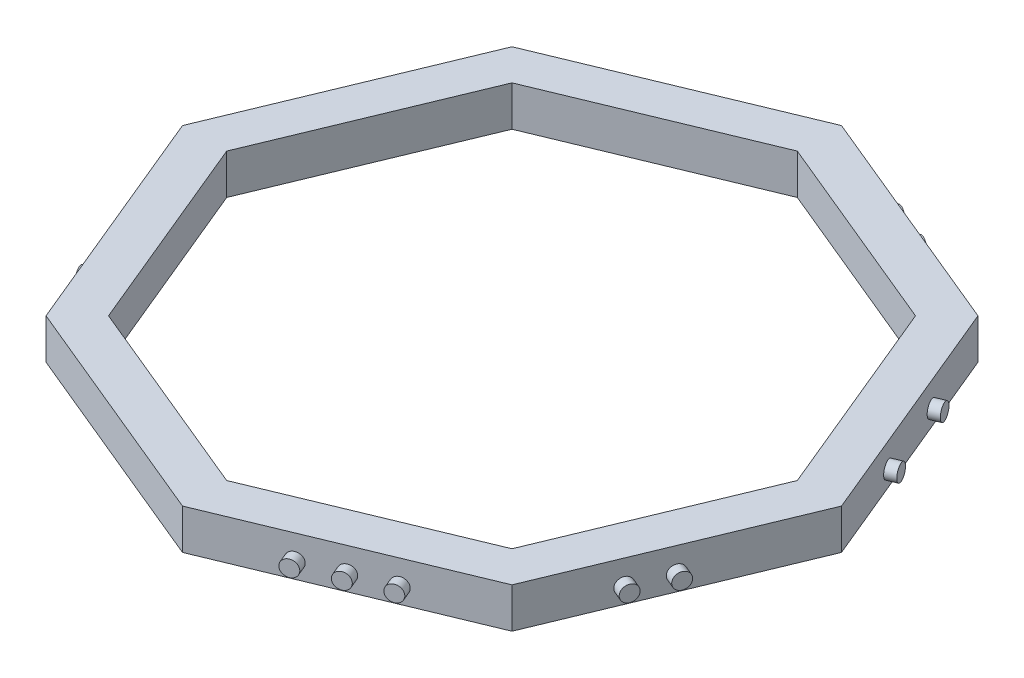
ISO-10303-21;
HEADER;
FILE_DESCRIPTION(('STEP AP214'),'2;1');
FILE_NAME('part.step','',(''),(''),'','','');
FILE_SCHEMA(('AUTOMOTIVE_DESIGN { 1 0 10303 214 1 1 1 1 }'));
ENDSEC;
DATA;
#1=APPLICATION_CONTEXT('core data for automotive mechanical design processes');
#2=APPLICATION_PROTOCOL_DEFINITION('international standard','automotive_design',2000,#1);
#3=PRODUCT_CONTEXT('',#1,'mechanical');
#4=PRODUCT('Part','Part','',(#3));
#5=PRODUCT_RELATED_PRODUCT_CATEGORY('part','',(#4));
#6=PRODUCT_DEFINITION_FORMATION('','',#4);
#7=PRODUCT_DEFINITION_CONTEXT('part definition',#1,'design');
#8=PRODUCT_DEFINITION('design','',#6,#7);
#9=PRODUCT_DEFINITION_SHAPE('','',#8);
#10=(LENGTH_UNIT() NAMED_UNIT(*) SI_UNIT(.MILLI.,.METRE.));
#11=(NAMED_UNIT(*) PLANE_ANGLE_UNIT() SI_UNIT($,.RADIAN.));
#12=(NAMED_UNIT(*) SI_UNIT($,.STERADIAN.) SOLID_ANGLE_UNIT());
#13=UNCERTAINTY_MEASURE_WITH_UNIT(LENGTH_MEASURE(1.E-05),#10,'distance_accuracy_value','');
#14=(GEOMETRIC_REPRESENTATION_CONTEXT(3) GLOBAL_UNCERTAINTY_ASSIGNED_CONTEXT((#13)) GLOBAL_UNIT_ASSIGNED_CONTEXT((#10,
#11,#12)) REPRESENTATION_CONTEXT('',''));
#15=CARTESIAN_POINT('',(0.,0.,0.));
#16=DIRECTION('',(0.,0.,1.));
#17=DIRECTION('',(1.,0.,0.));
#18=AXIS2_PLACEMENT_3D('',#15,#16,#17);
#19=CARTESIAN_POINT('',(28.9913780286488,5.,28.9913780286481));
#20=DIRECTION('',(-0.923879532511291,0.,-0.38268343236508));
#21=DIRECTION('',(-0.38268343236508,0.,0.923879532511291));
#22=AXIS2_PLACEMENT_3D('',#19,#20,#21);
#23=PLANE('',#22);
#24=CARTESIAN_POINT('',(34.9956890143244,2.,14.4956890143238));
#25=DIRECTION('',(-0.923879532511291,0.,-0.38268343236508));
#26=DIRECTION('',(-0.38268343236508,0.,0.923879532511291));
#27=AXIS2_PLACEMENT_3D('',#24,#25,#26);
#28=CIRCLE('',#27,1.);
#29=CARTESIAN_POINT('',(34.6130055819593,2.,15.4195685468351));
#30=VERTEX_POINT('',#29);
#31=EDGE_CURVE('E11',#30,#30,#28,.F.);
#32=ORIENTED_EDGE('',*,*,#31,.F.);
#33=EDGE_LOOP('',(#32));
#34=FACE_BOUND('',#33,.T.);
#35=CARTESIAN_POINT('',(33.082271852499,2.,19.1150866768803));
#36=DIRECTION('',(-0.923879532511291,0.,-0.38268343236508));
#37=DIRECTION('',(-0.38268343236508,0.,0.923879532511291));
#38=AXIS2_PLACEMENT_3D('',#35,#36,#37);
#39=CIRCLE('',#38,1.);
#40=CARTESIAN_POINT('',(32.6995884201339,2.,20.0389662093916));
#41=VERTEX_POINT('',#40);
#42=EDGE_CURVE('E40',#41,#41,#39,.F.);
#43=ORIENTED_EDGE('',*,*,#42,.F.);
#44=EDGE_LOOP('',(#43));
#45=FACE_BOUND('',#44,.T.);
#46=DIRECTION('',(0.38268343236508,0.,-0.923879532511291));
#47=VECTOR('',#46,1.);
#48=CARTESIAN_POINT('',(28.9913780286488,0.,28.9913780286481));
#49=LINE('',#48,#47);
#50=CARTESIAN_POINT('',(28.9913780286488,0.,28.9913780286481));
#51=VERTEX_POINT('',#50);
#52=CARTESIAN_POINT('',(41.,0.,-4.48023070960939E-13));
#53=VERTEX_POINT('',#52);
#54=EDGE_CURVE('E205',#51,#53,#49,.T.);
#55=ORIENTED_EDGE('',*,*,#54,.T.);
#56=DIRECTION('',(0.,-1.,0.));
#57=VECTOR('',#56,1.);
#58=CARTESIAN_POINT('',(41.,5.,-4.48023070960939E-13));
#59=LINE('',#58,#57);
#60=CARTESIAN_POINT('',(41.,5.,-4.48023070960939E-13));
#61=VERTEX_POINT('',#60);
#62=EDGE_CURVE('E271',#61,#53,#59,.T.);
#63=ORIENTED_EDGE('',*,*,#62,.F.);
#64=DIRECTION('',(0.38268343236508,0.,-0.923879532511291));
#65=VECTOR('',#64,1.);
#66=CARTESIAN_POINT('',(28.9913780286488,5.,28.9913780286481));
#67=LINE('',#66,#65);
#68=CARTESIAN_POINT('',(28.9913780286488,5.,28.9913780286481));
#69=VERTEX_POINT('',#68);
#70=EDGE_CURVE('E217',#69,#61,#67,.T.);
#71=ORIENTED_EDGE('',*,*,#70,.F.);
#72=DIRECTION('',(0.,-1.,0.));
#73=VECTOR('',#72,1.);
#74=CARTESIAN_POINT('',(28.9913780286488,5.,28.9913780286481));
#75=LINE('',#74,#73);
#76=EDGE_CURVE('E235',#69,#51,#75,.T.);
#77=ORIENTED_EDGE('',*,*,#76,.T.);
#78=EDGE_LOOP('',(#55,#63,#71,#77));
#79=FACE_BOUND('',#78,.T.);
#80=ADVANCED_FACE('F33',(#34,#45,#79),#23,.F.);
#81=CARTESIAN_POINT('',(41.,5.,-4.48023070960939E-13));
#82=DIRECTION('',(-0.923879532511283,0.,0.3826834323651));
#83=DIRECTION('',(0.3826834323651,0.,0.923879532511283));
#84=AXIS2_PLACEMENT_3D('',#81,#82,#83);
#85=PLANE('',#84);
#86=CARTESIAN_POINT('',(33.0822718524986,2.,-19.115086676881));
#87=DIRECTION('',(-0.923879532511283,0.,0.3826834323651));
#88=DIRECTION('',(0.3826834323651,0.,0.923879532511283));
#89=AXIS2_PLACEMENT_3D('',#86,#87,#88);
#90=CIRCLE('',#89,1.);
#91=CARTESIAN_POINT('',(33.4649552848637,2.,-18.1912071443697));
#92=VERTEX_POINT('',#91);
#93=EDGE_CURVE('E301',#92,#92,#90,.F.);
#94=ORIENTED_EDGE('',*,*,#93,.F.);
#95=EDGE_LOOP('',(#94));
#96=FACE_BOUND('',#95,.T.);
#97=CARTESIAN_POINT('',(36.9091061761496,2.,-9.8762913517682));
#98=DIRECTION('',(-0.923879532511283,0.,0.3826834323651));
#99=DIRECTION('',(0.3826834323651,0.,0.923879532511283));
#100=AXIS2_PLACEMENT_3D('',#97,#98,#99);
#101=CIRCLE('',#100,1.);
#102=CARTESIAN_POINT('',(37.2917896085147,2.,-8.95241181925691));
#103=VERTEX_POINT('',#102);
#104=EDGE_CURVE('E298',#103,#103,#101,.F.);
#105=ORIENTED_EDGE('',*,*,#104,.F.);
#106=EDGE_LOOP('',(#105));
#107=FACE_BOUND('',#106,.T.);
#108=DIRECTION('',(-0.3826834323651,0.,-0.923879532511283));
#109=VECTOR('',#108,1.);
#110=CARTESIAN_POINT('',(41.,0.,-4.48023070960939E-13));
#111=LINE('',#110,#109);
#112=CARTESIAN_POINT('',(28.9913780286481,0.,-28.9913780286488));
#113=VERTEX_POINT('',#112);
#114=EDGE_CURVE('E238',#53,#113,#111,.T.);
#115=ORIENTED_EDGE('',*,*,#114,.T.);
#116=DIRECTION('',(0.,-1.,0.));
#117=VECTOR('',#116,1.);
#118=CARTESIAN_POINT('',(28.9913780286481,5.,-28.9913780286488));
#119=LINE('',#118,#117);
#120=CARTESIAN_POINT('',(28.9913780286481,5.,-28.9913780286488));
#121=VERTEX_POINT('',#120);
#122=EDGE_CURVE('E268',#121,#113,#119,.T.);
#123=ORIENTED_EDGE('',*,*,#122,.F.);
#124=DIRECTION('',(-0.3826834323651,0.,-0.923879532511283));
#125=VECTOR('',#124,1.);
#126=CARTESIAN_POINT('',(41.,5.,-4.48023070960939E-13));
#127=LINE('',#126,#125);
#128=EDGE_CURVE('E220',#61,#121,#127,.T.);
#129=ORIENTED_EDGE('',*,*,#128,.F.);
#130=ORIENTED_EDGE('',*,*,#62,.T.);
#131=EDGE_LOOP('',(#115,#123,#129,#130));
#132=FACE_BOUND('',#131,.T.);
#133=ADVANCED_FACE('F310',(#96,#107,#132),#85,.F.);
#134=CARTESIAN_POINT('',(28.9913780286481,5.,-28.9913780286488));
#135=DIRECTION('',(-0.38268343236508,0.,0.923879532511291));
#136=DIRECTION('',(0.923879532511291,0.,0.38268343236508));
#137=AXIS2_PLACEMENT_3D('',#134,#135,#136);
#138=PLANE('',#137);
#139=CARTESIAN_POINT('',(9.87629135176739,2.,-36.9091061761498));
#140=DIRECTION('',(-0.38268343236508,0.,0.923879532511291));
#141=DIRECTION('',(0.923879532511291,0.,0.38268343236508));
#142=AXIS2_PLACEMENT_3D('',#139,#140,#141);
#143=CIRCLE('',#142,0.999999999999998);
#144=CARTESIAN_POINT('',(10.8001708842787,2.,-36.5264227437847));
#145=VERTEX_POINT('',#144);
#146=EDGE_CURVE('E295',#145,#145,#143,.F.);
#147=ORIENTED_EDGE('',*,*,#146,.F.);
#148=EDGE_LOOP('',(#147));
#149=FACE_BOUND('',#148,.T.);
#150=CARTESIAN_POINT('',(14.4956890143238,2.,-34.9956890143244));
#151=DIRECTION('',(-0.38268343236508,0.,0.923879532511291));
#152=DIRECTION('',(0.923879532511291,0.,0.38268343236508));
#153=AXIS2_PLACEMENT_3D('',#150,#151,#152);
#154=CIRCLE('',#153,1.);
#155=CARTESIAN_POINT('',(15.4195685468351,2.,-34.6130055819593));
#156=VERTEX_POINT('',#155);
#157=EDGE_CURVE('E292',#156,#156,#154,.F.);
#158=ORIENTED_EDGE('',*,*,#157,.F.);
#159=EDGE_LOOP('',(#158));
#160=FACE_BOUND('',#159,.T.);
#161=DIRECTION('',(-0.923879532511291,0.,-0.38268343236508));
#162=VECTOR('',#161,1.);
#163=CARTESIAN_POINT('',(28.9913780286481,0.,-28.9913780286488));
#164=LINE('',#163,#162);
#165=CARTESIAN_POINT('',(-4.51771650624012E-13,0.,-41.));
#166=VERTEX_POINT('',#165);
#167=EDGE_CURVE('E240',#113,#166,#164,.T.);
#168=ORIENTED_EDGE('',*,*,#167,.T.);
#169=DIRECTION('',(0.,-1.,0.));
#170=VECTOR('',#169,1.);
#171=CARTESIAN_POINT('',(-4.51771650624012E-13,5.,-41.));
#172=LINE('',#171,#170);
#173=CARTESIAN_POINT('',(-4.51771650624012E-13,5.,-41.));
#174=VERTEX_POINT('',#173);
#175=EDGE_CURVE('E265',#174,#166,#172,.T.);
#176=ORIENTED_EDGE('',*,*,#175,.F.);
#177=DIRECTION('',(-0.923879532511291,0.,-0.38268343236508));
#178=VECTOR('',#177,1.);
#179=CARTESIAN_POINT('',(28.9913780286481,5.,-28.9913780286488));
#180=LINE('',#179,#178);
#181=EDGE_CURVE('E223',#121,#174,#180,.T.);
#182=ORIENTED_EDGE('',*,*,#181,.F.);
#183=ORIENTED_EDGE('',*,*,#122,.T.);
#184=EDGE_LOOP('',(#168,#176,#182,#183));
#185=FACE_BOUND('',#184,.T.);
#186=ADVANCED_FACE('F348',(#149,#160,#185),#138,.F.);
#187=CARTESIAN_POINT('',(-4.51771650624012E-13,5.,-41.));
#188=DIRECTION('',(0.3826834323651,0.,0.923879532511283));
#189=DIRECTION('',(0.923879532511283,0.,-0.3826834323651));
#190=AXIS2_PLACEMENT_3D('',#187,#188,#189);
#191=PLANE('',#190);
#192=CARTESIAN_POINT('',(-9.8762913517682,2.,-36.9091061761496));
#193=DIRECTION('',(0.3826834323651,0.,0.923879532511283));
#194=DIRECTION('',(0.923879532511283,0.,-0.3826834323651));
#195=AXIS2_PLACEMENT_3D('',#192,#193,#194);
#196=CIRCLE('',#195,1.);
#197=CARTESIAN_POINT('',(-8.95241181925692,2.,-37.2917896085147));
#198=VERTEX_POINT('',#197);
#199=EDGE_CURVE('E289',#198,#198,#196,.F.);
#200=ORIENTED_EDGE('',*,*,#199,.F.);
#201=EDGE_LOOP('',(#200));
#202=FACE_BOUND('',#201,.T.);
#203=DIRECTION('',(-0.923879532511283,0.,0.3826834323651));
#204=VECTOR('',#203,1.);
#205=CARTESIAN_POINT('',(-4.51771650624012E-13,0.,-41.));
#206=LINE('',#205,#204);
#207=CARTESIAN_POINT('',(-28.9913780286488,0.,-28.9913780286481));
#208=VERTEX_POINT('',#207);
#209=EDGE_CURVE('E242',#166,#208,#206,.T.);
#210=ORIENTED_EDGE('',*,*,#209,.T.);
#211=DIRECTION('',(0.,-1.,0.));
#212=VECTOR('',#211,1.);
#213=CARTESIAN_POINT('',(-28.9913780286488,5.,-28.9913780286481));
#214=LINE('',#213,#212);
#215=CARTESIAN_POINT('',(-28.9913780286488,5.,-28.9913780286481));
#216=VERTEX_POINT('',#215);
#217=EDGE_CURVE('E262',#216,#208,#214,.T.);
#218=ORIENTED_EDGE('',*,*,#217,.F.);
#219=DIRECTION('',(-0.923879532511283,0.,0.3826834323651));
#220=VECTOR('',#219,1.);
#221=CARTESIAN_POINT('',(-4.51771650624012E-13,5.,-41.));
#222=LINE('',#221,#220);
#223=EDGE_CURVE('E225',#174,#216,#222,.T.);
#224=ORIENTED_EDGE('',*,*,#223,.F.);
#225=ORIENTED_EDGE('',*,*,#175,.T.);
#226=EDGE_LOOP('',(#210,#218,#224,#225));
#227=FACE_BOUND('',#226,.T.);
#228=ADVANCED_FACE('F345',(#202,#227),#191,.F.);
#229=CARTESIAN_POINT('',(-28.9913780286488,5.,-28.9913780286481));
#230=DIRECTION('',(0.923879532511291,0.,0.38268343236508));
#231=DIRECTION('',(0.38268343236508,0.,-0.923879532511291));
#232=AXIS2_PLACEMENT_3D('',#229,#230,#231);
#233=PLANE('',#232);
#234=CARTESIAN_POINT('',(-34.9956890143244,2.,-14.4956890143239));
#235=DIRECTION('',(0.923879532511291,0.,0.38268343236508));
#236=DIRECTION('',(0.38268343236508,0.,-0.923879532511291));
#237=AXIS2_PLACEMENT_3D('',#234,#235,#236);
#238=CIRCLE('',#237,0.999999999999998);
#239=CARTESIAN_POINT('',(-34.6130055819593,2.,-15.4195685468351));
#240=VERTEX_POINT('',#239);
#241=EDGE_CURVE('E286',#240,#240,#238,.F.);
#242=ORIENTED_EDGE('',*,*,#241,.F.);
#243=EDGE_LOOP('',(#242));
#244=FACE_BOUND('',#243,.T.);
#245=DIRECTION('',(-0.38268343236508,0.,0.923879532511291));
#246=VECTOR('',#245,1.);
#247=CARTESIAN_POINT('',(-28.9913780286488,0.,-28.9913780286481));
#248=LINE('',#247,#246);
#249=CARTESIAN_POINT('',(-41.,0.,4.3736829323662E-13));
#250=VERTEX_POINT('',#249);
#251=EDGE_CURVE('E244',#208,#250,#248,.T.);
#252=ORIENTED_EDGE('',*,*,#251,.T.);
#253=DIRECTION('',(0.,-1.,0.));
#254=VECTOR('',#253,1.);
#255=CARTESIAN_POINT('',(-41.,5.,4.3736829323662E-13));
#256=LINE('',#255,#254);
#257=CARTESIAN_POINT('',(-41.,5.,4.3736829323662E-13));
#258=VERTEX_POINT('',#257);
#259=EDGE_CURVE('E259',#258,#250,#256,.T.);
#260=ORIENTED_EDGE('',*,*,#259,.F.);
#261=DIRECTION('',(-0.38268343236508,0.,0.923879532511291));
#262=VECTOR('',#261,1.);
#263=CARTESIAN_POINT('',(-28.9913780286488,5.,-28.9913780286481));
#264=LINE('',#263,#262);
#265=EDGE_CURVE('E227',#216,#258,#264,.T.);
#266=ORIENTED_EDGE('',*,*,#265,.F.);
#267=ORIENTED_EDGE('',*,*,#217,.T.);
#268=EDGE_LOOP('',(#252,#260,#266,#267));
#269=FACE_BOUND('',#268,.T.);
#270=ADVANCED_FACE('F341',(#244,#269),#233,.F.);
#271=CARTESIAN_POINT('',(-41.,5.,4.3736829323662E-13));
#272=DIRECTION('',(0.923879532511283,0.,-0.3826834323651));
#273=DIRECTION('',(-0.3826834323651,0.,-0.923879532511283));
#274=AXIS2_PLACEMENT_3D('',#271,#272,#273);
#275=PLANE('',#274);
#276=CARTESIAN_POINT('',(-33.0822718524986,2.,19.115086676881));
#277=DIRECTION('',(0.923879532511283,0.,-0.3826834323651));
#278=DIRECTION('',(-0.3826834323651,0.,-0.923879532511283));
#279=AXIS2_PLACEMENT_3D('',#276,#277,#278);
#280=CIRCLE('',#279,1.);
#281=CARTESIAN_POINT('',(-33.4649552848637,2.,18.1912071443697));
#282=VERTEX_POINT('',#281);
#283=EDGE_CURVE('E283',#282,#282,#280,.F.);
#284=ORIENTED_EDGE('',*,*,#283,.F.);
#285=EDGE_LOOP('',(#284));
#286=FACE_BOUND('',#285,.T.);
#287=DIRECTION('',(0.3826834323651,0.,0.923879532511283));
#288=VECTOR('',#287,1.);
#289=CARTESIAN_POINT('',(-41.,0.,4.3736829323662E-13));
#290=LINE('',#289,#288);
#291=CARTESIAN_POINT('',(-28.9913780286481,0.,28.9913780286488));
#292=VERTEX_POINT('',#291);
#293=EDGE_CURVE('E246',#250,#292,#290,.T.);
#294=ORIENTED_EDGE('',*,*,#293,.T.);
#295=DIRECTION('',(0.,-1.,0.));
#296=VECTOR('',#295,1.);
#297=CARTESIAN_POINT('',(-28.9913780286481,5.,28.9913780286488));
#298=LINE('',#297,#296);
#299=CARTESIAN_POINT('',(-28.9913780286481,5.,28.9913780286488));
#300=VERTEX_POINT('',#299);
#301=EDGE_CURVE('E256',#300,#292,#298,.T.);
#302=ORIENTED_EDGE('',*,*,#301,.F.);
#303=DIRECTION('',(0.3826834323651,0.,0.923879532511283));
#304=VECTOR('',#303,1.);
#305=CARTESIAN_POINT('',(-41.,5.,4.3736829323662E-13));
#306=LINE('',#305,#304);
#307=EDGE_CURVE('E229',#258,#300,#306,.T.);
#308=ORIENTED_EDGE('',*,*,#307,.F.);
#309=ORIENTED_EDGE('',*,*,#259,.T.);
#310=EDGE_LOOP('',(#294,#302,#308,#309));
#311=FACE_BOUND('',#310,.T.);
#312=ADVANCED_FACE('F336',(#286,#311),#275,.F.);
#313=CARTESIAN_POINT('',(-28.9913780286481,5.,28.9913780286488));
#314=DIRECTION('',(0.382683432365079,0.,-0.923879532511291));
#315=DIRECTION('',(-0.923879532511291,0.,-0.382683432365079));
#316=AXIS2_PLACEMENT_3D('',#313,#314,#315);
#317=PLANE('',#316);
#318=DIRECTION('',(0.923879532511291,0.,0.382683432365079));
#319=VECTOR('',#318,1.);
#320=CARTESIAN_POINT('',(-28.9913780286481,0.,28.9913780286488));
#321=LINE('',#320,#319);
#322=CARTESIAN_POINT('',(4.40747933146162E-13,0.,41.));
#323=VERTEX_POINT('',#322);
#324=EDGE_CURVE('E248',#292,#323,#321,.T.);
#325=ORIENTED_EDGE('',*,*,#324,.T.);
#326=DIRECTION('',(0.,-1.,0.));
#327=VECTOR('',#326,1.);
#328=CARTESIAN_POINT('',(4.40747933146162E-13,5.,41.));
#329=LINE('',#328,#327);
#330=CARTESIAN_POINT('',(4.40747933146162E-13,5.,41.));
#331=VERTEX_POINT('',#330);
#332=EDGE_CURVE('E253',#331,#323,#329,.T.);
#333=ORIENTED_EDGE('',*,*,#332,.F.);
#334=DIRECTION('',(0.923879532511291,0.,0.382683432365079));
#335=VECTOR('',#334,1.);
#336=CARTESIAN_POINT('',(-28.9913780286481,5.,28.9913780286488));
#337=LINE('',#336,#335);
#338=EDGE_CURVE('E231',#300,#331,#337,.T.);
#339=ORIENTED_EDGE('',*,*,#338,.F.);
#340=ORIENTED_EDGE('',*,*,#301,.T.);
#341=EDGE_LOOP('',(#325,#333,#339,#340));
#342=FACE_BOUND('',#341,.T.);
#343=ADVANCED_FACE('F331',(#342),#317,.F.);
#344=CARTESIAN_POINT('',(4.40747933146162E-13,5.,41.));
#345=DIRECTION('',(-0.3826834323651,0.,-0.923879532511283));
#346=DIRECTION('',(-0.923879532511283,0.,0.3826834323651));
#347=AXIS2_PLACEMENT_3D('',#344,#345,#346);
#348=PLANE('',#347);
#349=CARTESIAN_POINT('',(14.4956890143246,2.,34.9956890143241));
#350=DIRECTION('',(-0.3826834323651,0.,-0.923879532511283));
#351=DIRECTION('',(-0.923879532511283,0.,0.3826834323651));
#352=AXIS2_PLACEMENT_3D('',#349,#350,#351);
#353=CIRCLE('',#352,1.);
#354=CARTESIAN_POINT('',(13.5718094818133,2.,35.3783724466892));
#355=VERTEX_POINT('',#354);
#356=EDGE_CURVE('E280',#355,#355,#353,.F.);
#357=ORIENTED_EDGE('',*,*,#356,.F.);
#358=EDGE_LOOP('',(#357));
#359=FACE_BOUND('',#358,.T.);
#360=CARTESIAN_POINT('',(9.87629135176818,2.,36.9091061761496));
#361=DIRECTION('',(-0.3826834323651,0.,-0.923879532511283));
#362=DIRECTION('',(-0.923879532511283,0.,0.3826834323651));
#363=AXIS2_PLACEMENT_3D('',#360,#361,#362);
#364=CIRCLE('',#363,1.);
#365=CARTESIAN_POINT('',(8.9524118192569,2.,37.2917896085147));
#366=VERTEX_POINT('',#365);
#367=EDGE_CURVE('E277',#366,#366,#364,.F.);
#368=ORIENTED_EDGE('',*,*,#367,.F.);
#369=EDGE_LOOP('',(#368));
#370=FACE_BOUND('',#369,.T.);
#371=CARTESIAN_POINT('',(19.115086676881,2.,33.0822718524986));
#372=DIRECTION('',(-0.3826834323651,0.,-0.923879532511283));
#373=DIRECTION('',(-0.923879532511283,0.,0.3826834323651));
#374=AXIS2_PLACEMENT_3D('',#371,#372,#373);
#375=CIRCLE('',#374,1.);
#376=CARTESIAN_POINT('',(18.1912071443697,2.,33.4649552848637));
#377=VERTEX_POINT('',#376);
#378=EDGE_CURVE('E274',#377,#377,#375,.F.);
#379=ORIENTED_EDGE('',*,*,#378,.F.);
#380=EDGE_LOOP('',(#379));
#381=FACE_BOUND('',#380,.T.);
#382=DIRECTION('',(0.923879532511283,0.,-0.3826834323651));
#383=VECTOR('',#382,1.);
#384=CARTESIAN_POINT('',(4.40747933146162E-13,0.,41.));
#385=LINE('',#384,#383);
#386=EDGE_CURVE('E221',#323,#51,#385,.T.);
#387=ORIENTED_EDGE('',*,*,#386,.T.);
#388=ORIENTED_EDGE('',*,*,#76,.F.);
#389=DIRECTION('',(0.923879532511283,0.,-0.3826834323651));
#390=VECTOR('',#389,1.);
#391=CARTESIAN_POINT('',(4.40747933146162E-13,5.,41.));
#392=LINE('',#391,#390);
#393=EDGE_CURVE('E233',#331,#69,#392,.T.);
#394=ORIENTED_EDGE('',*,*,#393,.F.);
#395=ORIENTED_EDGE('',*,*,#332,.T.);
#396=EDGE_LOOP('',(#387,#388,#394,#395));
#397=FACE_BOUND('',#396,.T.);
#398=ADVANCED_FACE('F329',(#359,#370,#381,#397),#348,.F.);
#399=CARTESIAN_POINT('',(0.,5.,0.));
#400=DIRECTION('',(0.,1.,0.));
#401=DIRECTION('',(0.,0.,1.));
#402=AXIS2_PLACEMENT_3D('',#399,#400,#401);
#403=PLANE('',#402);
#404=DIRECTION('',(0.382683432365079,0.,-0.923879532511291));
#405=VECTOR('',#404,1.);
#406=CARTESIAN_POINT('',(25.1022907321227,5.,25.1022907321221));
#407=LINE('',#406,#405);
#408=CARTESIAN_POINT('',(25.1022907321227,5.,25.1022907321221));
#409=VERTEX_POINT('',#408);
#410=CARTESIAN_POINT('',(35.5,5.,-4.14598910758457E-13));
#411=VERTEX_POINT('',#410);
#412=EDGE_CURVE('E47',#409,#411,#407,.T.);
#413=ORIENTED_EDGE('',*,*,#412,.F.);
#414=DIRECTION('',(0.923879532511282,0.,-0.3826834323651));
#415=VECTOR('',#414,1.);
#416=CARTESIAN_POINT('',(4.11558147603379E-13,5.,35.5));
#417=LINE('',#416,#415);
#418=CARTESIAN_POINT('',(4.11558147603379E-13,5.,35.5));
#419=VERTEX_POINT('',#418);
#420=EDGE_CURVE('E164',#419,#409,#417,.T.);
#421=ORIENTED_EDGE('',*,*,#420,.F.);
#422=DIRECTION('',(0.923879532511291,0.,0.382683432365079));
#423=VECTOR('',#422,1.);
#424=CARTESIAN_POINT('',(-25.1022907321221,5.,25.1022907321227));
#425=LINE('',#424,#423);
#426=CARTESIAN_POINT('',(-25.1022907321221,5.,25.1022907321227));
#427=VERTEX_POINT('',#426);
#428=EDGE_CURVE('E167',#427,#419,#425,.T.);
#429=ORIENTED_EDGE('',*,*,#428,.F.);
#430=DIRECTION('',(0.3826834323651,0.,0.923879532511282));
#431=VECTOR('',#430,1.);
#432=CARTESIAN_POINT('',(-35.5,5.,4.19907979075131E-13));
#433=LINE('',#432,#431);
#434=CARTESIAN_POINT('',(-35.5,5.,4.19907979075131E-13));
#435=VERTEX_POINT('',#434);
#436=EDGE_CURVE('E198',#435,#427,#433,.T.);
#437=ORIENTED_EDGE('',*,*,#436,.F.);
#438=DIRECTION('',(-0.382683432365079,0.,0.923879532511292));
#439=VECTOR('',#438,1.);
#440=CARTESIAN_POINT('',(-25.1022907321227,5.,-25.1022907321222));
#441=LINE('',#440,#439);
#442=CARTESIAN_POINT('',(-25.1022907321227,5.,-25.1022907321222));
#443=VERTEX_POINT('',#442);
#444=EDGE_CURVE('E195',#443,#435,#441,.T.);
#445=ORIENTED_EDGE('',*,*,#444,.F.);
#446=DIRECTION('',(-0.923879532511282,0.,0.382683432365101));
#447=VECTOR('',#446,1.);
#448=CARTESIAN_POINT('',(-4.26727433334439E-13,5.,-35.5));
#449=LINE('',#448,#447);
#450=CARTESIAN_POINT('',(-4.26727433334439E-13,5.,-35.5));
#451=VERTEX_POINT('',#450);
#452=EDGE_CURVE('E192',#451,#443,#449,.T.);
#453=ORIENTED_EDGE('',*,*,#452,.F.);
#454=DIRECTION('',(-0.923879532511291,0.,-0.382683432365079));
#455=VECTOR('',#454,1.);
#456=CARTESIAN_POINT('',(25.1022907321221,5.,-25.1022907321227));
#457=LINE('',#456,#455);
#458=CARTESIAN_POINT('',(25.1022907321221,5.,-25.1022907321227));
#459=VERTEX_POINT('',#458);
#460=EDGE_CURVE('E189',#459,#451,#457,.T.);
#461=ORIENTED_EDGE('',*,*,#460,.F.);
#462=DIRECTION('',(-0.3826834323651,0.,-0.923879532511282));
#463=VECTOR('',#462,1.);
#464=CARTESIAN_POINT('',(35.5,5.,-4.17393743025308E-13));
#465=LINE('',#464,#463);
#466=EDGE_CURVE('E187',#411,#459,#465,.T.);
#467=ORIENTED_EDGE('',*,*,#466,.F.);
#468=EDGE_LOOP('',(#413,#421,#429,#437,#445,#453,#461,#467));
#469=FACE_BOUND('',#468,.T.);
#470=ORIENTED_EDGE('',*,*,#70,.T.);
#471=ORIENTED_EDGE('',*,*,#128,.T.);
#472=ORIENTED_EDGE('',*,*,#181,.T.);
#473=ORIENTED_EDGE('',*,*,#223,.T.);
#474=ORIENTED_EDGE('',*,*,#265,.T.);
#475=ORIENTED_EDGE('',*,*,#307,.T.);
#476=ORIENTED_EDGE('',*,*,#338,.T.);
#477=ORIENTED_EDGE('',*,*,#393,.T.);
#478=EDGE_LOOP('',(#470,#471,#472,#473,#474,#475,#476,#477));
#479=FACE_BOUND('',#478,.T.);
#480=ADVANCED_FACE('F324',(#469,#479),#403,.T.);
#481=CARTESIAN_POINT('',(0.,0.,0.));
#482=DIRECTION('',(0.,1.,0.));
#483=DIRECTION('',(0.,0.,1.));
#484=AXIS2_PLACEMENT_3D('',#481,#482,#483);
#485=PLANE('',#484);
#486=DIRECTION('',(0.923879532511282,0.,-0.3826834323651));
#487=VECTOR('',#486,1.);
#488=CARTESIAN_POINT('',(4.11558147603379E-13,0.,35.5));
#489=LINE('',#488,#487);
#490=CARTESIAN_POINT('',(4.11558147603379E-13,0.,35.5));
#491=VERTEX_POINT('',#490);
#492=CARTESIAN_POINT('',(25.1022907321227,0.,25.1022907321221));
#493=VERTEX_POINT('',#492);
#494=EDGE_CURVE('E153',#491,#493,#489,.T.);
#495=ORIENTED_EDGE('',*,*,#494,.T.);
#496=DIRECTION('',(0.382683432365079,0.,-0.923879532511291));
#497=VECTOR('',#496,1.);
#498=CARTESIAN_POINT('',(25.1022907321227,0.,25.1022907321221));
#499=LINE('',#498,#497);
#500=CARTESIAN_POINT('',(35.5,0.,-4.17393743025308E-13));
#501=VERTEX_POINT('',#500);
#502=EDGE_CURVE('E147',#493,#501,#499,.T.);
#503=ORIENTED_EDGE('',*,*,#502,.T.);
#504=DIRECTION('',(-0.3826834323651,0.,-0.923879532511282));
#505=VECTOR('',#504,1.);
#506=CARTESIAN_POINT('',(35.5,0.,-4.17393743025308E-13));
#507=LINE('',#506,#505);
#508=CARTESIAN_POINT('',(25.1022907321221,0.,-25.1022907321227));
#509=VERTEX_POINT('',#508);
#510=EDGE_CURVE('E156',#501,#509,#507,.T.);
#511=ORIENTED_EDGE('',*,*,#510,.T.);
#512=DIRECTION('',(-0.923879532511291,0.,-0.382683432365079));
#513=VECTOR('',#512,1.);
#514=CARTESIAN_POINT('',(25.1022907321221,0.,-25.1022907321227));
#515=LINE('',#514,#513);
#516=CARTESIAN_POINT('',(-4.26727433334439E-13,0.,-35.5));
#517=VERTEX_POINT('',#516);
#518=EDGE_CURVE('E55',#509,#517,#515,.T.);
#519=ORIENTED_EDGE('',*,*,#518,.T.);
#520=DIRECTION('',(-0.923879532511282,0.,0.382683432365101));
#521=VECTOR('',#520,1.);
#522=CARTESIAN_POINT('',(-4.26727433334439E-13,0.,-35.5));
#523=LINE('',#522,#521);
#524=CARTESIAN_POINT('',(-25.1022907321227,0.,-25.1022907321222));
#525=VERTEX_POINT('',#524);
#526=EDGE_CURVE('E174',#517,#525,#523,.T.);
#527=ORIENTED_EDGE('',*,*,#526,.T.);
#528=DIRECTION('',(-0.382683432365079,0.,0.923879532511292));
#529=VECTOR('',#528,1.);
#530=CARTESIAN_POINT('',(-25.1022907321227,0.,-25.1022907321222));
#531=LINE('',#530,#529);
#532=CARTESIAN_POINT('',(-35.5,0.,4.19907979075131E-13));
#533=VERTEX_POINT('',#532);
#534=EDGE_CURVE('E177',#525,#533,#531,.T.);
#535=ORIENTED_EDGE('',*,*,#534,.T.);
#536=DIRECTION('',(0.3826834323651,0.,0.923879532511282));
#537=VECTOR('',#536,1.);
#538=CARTESIAN_POINT('',(-35.5,0.,4.19907979075131E-13));
#539=LINE('',#538,#537);
#540=CARTESIAN_POINT('',(-25.1022907321221,0.,25.1022907321227));
#541=VERTEX_POINT('',#540);
#542=EDGE_CURVE('E180',#533,#541,#539,.T.);
#543=ORIENTED_EDGE('',*,*,#542,.T.);
#544=DIRECTION('',(0.923879532511291,0.,0.382683432365079));
#545=VECTOR('',#544,1.);
#546=CARTESIAN_POINT('',(-25.1022907321221,0.,25.1022907321227));
#547=LINE('',#546,#545);
#548=EDGE_CURVE('E183',#541,#491,#547,.T.);
#549=ORIENTED_EDGE('',*,*,#548,.T.);
#550=EDGE_LOOP('',(#495,#503,#511,#519,#527,#535,#543,#549));
#551=FACE_BOUND('',#550,.T.);
#552=ORIENTED_EDGE('',*,*,#54,.F.);
#553=ORIENTED_EDGE('',*,*,#386,.F.);
#554=ORIENTED_EDGE('',*,*,#324,.F.);
#555=ORIENTED_EDGE('',*,*,#293,.F.);
#556=ORIENTED_EDGE('',*,*,#251,.F.);
#557=ORIENTED_EDGE('',*,*,#209,.F.);
#558=ORIENTED_EDGE('',*,*,#167,.F.);
#559=ORIENTED_EDGE('',*,*,#114,.F.);
#560=EDGE_LOOP('',(#552,#553,#554,#555,#556,#557,#558,#559));
#561=FACE_BOUND('',#560,.T.);
#562=ADVANCED_FACE('F160',(#551,#561),#485,.F.);
#563=CARTESIAN_POINT('',(25.1022907321227,0.,25.1022907321221));
#564=DIRECTION('',(0.923879532511291,0.,0.382683432365079));
#565=DIRECTION('',(0.382683432365079,0.,-0.923879532511291));
#566=AXIS2_PLACEMENT_3D('',#563,#564,#565);
#567=PLANE('',#566);
#568=ORIENTED_EDGE('',*,*,#412,.T.);
#569=DIRECTION('',(0.,1.,0.));
#570=VECTOR('',#569,1.);
#571=CARTESIAN_POINT('',(35.5,0.,-4.17393743025308E-13));
#572=LINE('',#571,#570);
#573=EDGE_CURVE('E143',#501,#411,#572,.T.);
#574=ORIENTED_EDGE('',*,*,#573,.F.);
#575=ORIENTED_EDGE('',*,*,#502,.F.);
#576=DIRECTION('',(0.,1.,0.));
#577=VECTOR('',#576,1.);
#578=CARTESIAN_POINT('',(25.1022907321227,0.,25.1022907321221));
#579=LINE('',#578,#577);
#580=EDGE_CURVE('E203',#493,#409,#579,.T.);
#581=ORIENTED_EDGE('',*,*,#580,.T.);
#582=EDGE_LOOP('',(#568,#574,#575,#581));
#583=FACE_BOUND('',#582,.T.);
#584=ADVANCED_FACE('F145',(#583),#567,.F.);
#585=CARTESIAN_POINT('',(4.11558147603379E-13,0.,35.5));
#586=DIRECTION('',(0.3826834323651,0.,0.923879532511282));
#587=DIRECTION('',(0.923879532511282,0.,-0.3826834323651));
#588=AXIS2_PLACEMENT_3D('',#585,#586,#587);
#589=PLANE('',#588);
#590=ORIENTED_EDGE('',*,*,#420,.T.);
#591=ORIENTED_EDGE('',*,*,#580,.F.);
#592=ORIENTED_EDGE('',*,*,#494,.F.);
#593=DIRECTION('',(0.,1.,0.));
#594=VECTOR('',#593,1.);
#595=CARTESIAN_POINT('',(4.11558147603379E-13,0.,35.5));
#596=LINE('',#595,#594);
#597=EDGE_CURVE('E206',#491,#419,#596,.T.);
#598=ORIENTED_EDGE('',*,*,#597,.T.);
#599=EDGE_LOOP('',(#590,#591,#592,#598));
#600=FACE_BOUND('',#599,.T.);
#601=ADVANCED_FACE('F380',(#600),#589,.F.);
#602=CARTESIAN_POINT('',(-25.1022907321221,0.,25.1022907321227));
#603=DIRECTION('',(-0.382683432365079,0.,0.923879532511291));
#604=DIRECTION('',(0.923879532511291,0.,0.382683432365079));
#605=AXIS2_PLACEMENT_3D('',#602,#603,#604);
#606=PLANE('',#605);
#607=ORIENTED_EDGE('',*,*,#428,.T.);
#608=ORIENTED_EDGE('',*,*,#597,.F.);
#609=ORIENTED_EDGE('',*,*,#548,.F.);
#610=DIRECTION('',(0.,1.,0.));
#611=VECTOR('',#610,1.);
#612=CARTESIAN_POINT('',(-25.1022907321221,0.,25.1022907321227));
#613=LINE('',#612,#611);
#614=EDGE_CURVE('E208',#541,#427,#613,.T.);
#615=ORIENTED_EDGE('',*,*,#614,.T.);
#616=EDGE_LOOP('',(#607,#608,#609,#615));
#617=FACE_BOUND('',#616,.T.);
#618=ADVANCED_FACE('F398',(#617),#606,.F.);
#619=CARTESIAN_POINT('',(-35.5,0.,4.19907979075131E-13));
#620=DIRECTION('',(-0.923879532511282,0.,0.3826834323651));
#621=DIRECTION('',(0.3826834323651,0.,0.923879532511282));
#622=AXIS2_PLACEMENT_3D('',#619,#620,#621);
#623=PLANE('',#622);
#624=ORIENTED_EDGE('',*,*,#436,.T.);
#625=ORIENTED_EDGE('',*,*,#614,.F.);
#626=ORIENTED_EDGE('',*,*,#542,.F.);
#627=DIRECTION('',(0.,1.,0.));
#628=VECTOR('',#627,1.);
#629=CARTESIAN_POINT('',(-35.5,0.,4.19907979075131E-13));
#630=LINE('',#629,#628);
#631=EDGE_CURVE('E210',#533,#435,#630,.T.);
#632=ORIENTED_EDGE('',*,*,#631,.T.);
#633=EDGE_LOOP('',(#624,#625,#626,#632));
#634=FACE_BOUND('',#633,.T.);
#635=ADVANCED_FACE('F394',(#634),#623,.F.);
#636=CARTESIAN_POINT('',(-25.1022907321227,0.,-25.1022907321222));
#637=DIRECTION('',(-0.923879532511291,0.,-0.382683432365079));
#638=DIRECTION('',(-0.382683432365079,0.,0.923879532511291));
#639=AXIS2_PLACEMENT_3D('',#636,#637,#638);
#640=PLANE('',#639);
#641=ORIENTED_EDGE('',*,*,#444,.T.);
#642=ORIENTED_EDGE('',*,*,#631,.F.);
#643=ORIENTED_EDGE('',*,*,#534,.F.);
#644=DIRECTION('',(0.,1.,0.));
#645=VECTOR('',#644,1.);
#646=CARTESIAN_POINT('',(-25.1022907321227,0.,-25.1022907321222));
#647=LINE('',#646,#645);
#648=EDGE_CURVE('E212',#525,#443,#647,.T.);
#649=ORIENTED_EDGE('',*,*,#648,.T.);
#650=EDGE_LOOP('',(#641,#642,#643,#649));
#651=FACE_BOUND('',#650,.T.);
#652=ADVANCED_FACE('F390',(#651),#640,.F.);
#653=CARTESIAN_POINT('',(-4.26727433334439E-13,0.,-35.5));
#654=DIRECTION('',(-0.382683432365101,0.,-0.923879532511282));
#655=DIRECTION('',(-0.923879532511282,0.,0.382683432365101));
#656=AXIS2_PLACEMENT_3D('',#653,#654,#655);
#657=PLANE('',#656);
#658=ORIENTED_EDGE('',*,*,#452,.T.);
#659=ORIENTED_EDGE('',*,*,#648,.F.);
#660=ORIENTED_EDGE('',*,*,#526,.F.);
#661=DIRECTION('',(0.,1.,0.));
#662=VECTOR('',#661,1.);
#663=CARTESIAN_POINT('',(-4.26727433334439E-13,0.,-35.5));
#664=LINE('',#663,#662);
#665=EDGE_CURVE('E214',#517,#451,#664,.T.);
#666=ORIENTED_EDGE('',*,*,#665,.T.);
#667=EDGE_LOOP('',(#658,#659,#660,#666));
#668=FACE_BOUND('',#667,.T.);
#669=ADVANCED_FACE('F387',(#668),#657,.F.);
#670=CARTESIAN_POINT('',(25.1022907321221,0.,-25.1022907321227));
#671=DIRECTION('',(0.382683432365079,0.,-0.923879532511291));
#672=DIRECTION('',(-0.923879532511291,0.,-0.382683432365079));
#673=AXIS2_PLACEMENT_3D('',#670,#671,#672);
#674=PLANE('',#673);
#675=ORIENTED_EDGE('',*,*,#460,.T.);
#676=ORIENTED_EDGE('',*,*,#665,.F.);
#677=ORIENTED_EDGE('',*,*,#518,.F.);
#678=DIRECTION('',(0.,1.,0.));
#679=VECTOR('',#678,1.);
#680=CARTESIAN_POINT('',(25.1022907321221,0.,-25.1022907321227));
#681=LINE('',#680,#679);
#682=EDGE_CURVE('E152',#509,#459,#681,.T.);
#683=ORIENTED_EDGE('',*,*,#682,.T.);
#684=EDGE_LOOP('',(#675,#676,#677,#683));
#685=FACE_BOUND('',#684,.T.);
#686=ADVANCED_FACE('F384',(#685),#674,.F.);
#687=CARTESIAN_POINT('',(35.5,0.,-4.17393743025308E-13));
#688=DIRECTION('',(0.923879532511282,0.,-0.3826834323651));
#689=DIRECTION('',(-0.3826834323651,0.,-0.923879532511282));
#690=AXIS2_PLACEMENT_3D('',#687,#688,#689);
#691=PLANE('',#690);
#692=ORIENTED_EDGE('',*,*,#466,.T.);
#693=ORIENTED_EDGE('',*,*,#682,.F.);
#694=ORIENTED_EDGE('',*,*,#510,.F.);
#695=ORIENTED_EDGE('',*,*,#573,.T.);
#696=EDGE_LOOP('',(#692,#693,#694,#695));
#697=FACE_BOUND('',#696,.T.);
#698=ADVANCED_FACE('F157',(#697),#691,.F.);
#699=CARTESIAN_POINT('',(19.5934409673374,2.,34.2371212681377));
#700=DIRECTION('',(-0.3826834323651,0.,-0.923879532511283));
#701=DIRECTION('',(-0.923879532511283,0.,0.3826834323651));
#702=AXIS2_PLACEMENT_3D('',#699,#700,#701);
#703=CYLINDRICAL_SURFACE('',#702,1.);
#704=CARTESIAN_POINT('',(19.5934409673374,2.,34.2371212681377));
#705=DIRECTION('',(0.3826834323651,0.,0.923879532511283));
#706=DIRECTION('',(0.923879532511283,0.,-0.3826834323651));
#707=AXIS2_PLACEMENT_3D('',#704,#705,#706);
#708=CIRCLE('',#707,1.);
#709=CARTESIAN_POINT('',(20.5173204998487,2.,33.8544378357726));
#710=VERTEX_POINT('',#709);
#711=EDGE_CURVE('E170',#710,#710,#708,.T.);
#712=ORIENTED_EDGE('',*,*,#711,.F.);
#713=EDGE_LOOP('',(#712));
#714=FACE_BOUND('',#713,.T.);
#715=ORIENTED_EDGE('',*,*,#378,.T.);
#716=EDGE_LOOP('',(#715));
#717=FACE_BOUND('',#716,.T.);
#718=ADVANCED_FACE('F383',(#714,#717),#703,.T.);
#719=CARTESIAN_POINT('',(19.5934409673374,2.,34.2371212681377));
#720=DIRECTION('',(0.3826834323651,0.,0.923879532511283));
#721=DIRECTION('',(0.923879532511283,0.,-0.3826834323651));
#722=AXIS2_PLACEMENT_3D('',#719,#720,#721);
#723=PLANE('',#722);
#724=ORIENTED_EDGE('',*,*,#711,.T.);
#725=EDGE_LOOP('',(#724));
#726=FACE_BOUND('',#725,.T.);
#727=ADVANCED_FACE('F408',(#726),#723,.T.);
#728=CARTESIAN_POINT('',(10.3546456422246,2.,38.0639555917887));
#729=DIRECTION('',(-0.3826834323651,0.,-0.923879532511283));
#730=DIRECTION('',(-0.923879532511283,0.,0.3826834323651));
#731=AXIS2_PLACEMENT_3D('',#728,#729,#730);
#732=CYLINDRICAL_SURFACE('',#731,1.);
#733=CARTESIAN_POINT('',(10.3546456422246,2.,38.0639555917887));
#734=DIRECTION('',(0.3826834323651,0.,0.923879532511283));
#735=DIRECTION('',(0.923879532511283,0.,-0.3826834323651));
#736=AXIS2_PLACEMENT_3D('',#733,#734,#735);
#737=CIRCLE('',#736,1.);
#738=CARTESIAN_POINT('',(11.2785251747358,2.,37.6812721594236));
#739=VERTEX_POINT('',#738);
#740=EDGE_CURVE('E534',#739,#739,#737,.T.);
#741=ORIENTED_EDGE('',*,*,#740,.F.);
#742=EDGE_LOOP('',(#741));
#743=FACE_BOUND('',#742,.T.);
#744=ORIENTED_EDGE('',*,*,#367,.T.);
#745=EDGE_LOOP('',(#744));
#746=FACE_BOUND('',#745,.T.);
#747=ADVANCED_FACE('F412',(#743,#746),#732,.T.);
#748=CARTESIAN_POINT('',(10.3546456422246,2.,38.0639555917887));
#749=DIRECTION('',(0.3826834323651,0.,0.923879532511283));
#750=DIRECTION('',(0.923879532511283,0.,-0.3826834323651));
#751=AXIS2_PLACEMENT_3D('',#748,#749,#750);
#752=PLANE('',#751);
#753=ORIENTED_EDGE('',*,*,#740,.T.);
#754=EDGE_LOOP('',(#753));
#755=FACE_BOUND('',#754,.T.);
#756=ADVANCED_FACE('F414',(#755),#752,.T.);
#757=CARTESIAN_POINT('',(14.974043304781,2.,36.1505384299632));
#758=DIRECTION('',(-0.3826834323651,0.,-0.923879532511283));
#759=DIRECTION('',(-0.923879532511283,0.,0.3826834323651));
#760=AXIS2_PLACEMENT_3D('',#757,#758,#759);
#761=CYLINDRICAL_SURFACE('',#760,1.);
#762=CARTESIAN_POINT('',(14.974043304781,2.,36.1505384299632));
#763=DIRECTION('',(0.3826834323651,0.,0.923879532511283));
#764=DIRECTION('',(0.923879532511283,0.,-0.3826834323651));
#765=AXIS2_PLACEMENT_3D('',#762,#763,#764);
#766=CIRCLE('',#765,1.);
#767=CARTESIAN_POINT('',(15.8979228372923,2.,35.7678549975981));
#768=VERTEX_POINT('',#767);
#769=EDGE_CURVE('E532',#768,#768,#766,.T.);
#770=ORIENTED_EDGE('',*,*,#769,.F.);
#771=EDGE_LOOP('',(#770));
#772=FACE_BOUND('',#771,.T.);
#773=ORIENTED_EDGE('',*,*,#356,.T.);
#774=EDGE_LOOP('',(#773));
#775=FACE_BOUND('',#774,.T.);
#776=ADVANCED_FACE('F417',(#772,#775),#761,.T.);
#777=CARTESIAN_POINT('',(14.974043304781,2.,36.1505384299632));
#778=DIRECTION('',(0.3826834323651,0.,0.923879532511283));
#779=DIRECTION('',(0.923879532511283,0.,-0.3826834323651));
#780=AXIS2_PLACEMENT_3D('',#777,#778,#779);
#781=PLANE('',#780);
#782=ORIENTED_EDGE('',*,*,#769,.T.);
#783=EDGE_LOOP('',(#782));
#784=FACE_BOUND('',#783,.T.);
#785=ADVANCED_FACE('F422',(#784),#781,.T.);
#786=CARTESIAN_POINT('',(-34.2371212681377,2.,19.5934409673374));
#787=DIRECTION('',(0.923879532511283,0.,-0.3826834323651));
#788=DIRECTION('',(-0.3826834323651,0.,-0.923879532511283));
#789=AXIS2_PLACEMENT_3D('',#786,#787,#788);
#790=CYLINDRICAL_SURFACE('',#789,1.);
#791=CARTESIAN_POINT('',(-34.2371212681377,2.,19.5934409673374));
#792=DIRECTION('',(-0.923879532511283,0.,0.3826834323651));
#793=DIRECTION('',(0.3826834323651,0.,0.923879532511283));
#794=AXIS2_PLACEMENT_3D('',#791,#792,#793);
#795=CIRCLE('',#794,1.);
#796=CARTESIAN_POINT('',(-33.8544378357726,2.,20.5173204998487));
#797=VERTEX_POINT('',#796);
#798=EDGE_CURVE('E529',#797,#797,#795,.T.);
#799=ORIENTED_EDGE('',*,*,#798,.F.);
#800=EDGE_LOOP('',(#799));
#801=FACE_BOUND('',#800,.T.);
#802=ORIENTED_EDGE('',*,*,#283,.T.);
#803=EDGE_LOOP('',(#802));
#804=FACE_BOUND('',#803,.T.);
#805=ADVANCED_FACE('F425',(#801,#804),#790,.T.);
#806=CARTESIAN_POINT('',(-34.2371212681377,2.,19.5934409673374));
#807=DIRECTION('',(-0.923879532511283,0.,0.3826834323651));
#808=DIRECTION('',(0.3826834323651,0.,0.923879532511283));
#809=AXIS2_PLACEMENT_3D('',#806,#807,#808);
#810=PLANE('',#809);
#811=ORIENTED_EDGE('',*,*,#798,.T.);
#812=EDGE_LOOP('',(#811));
#813=FACE_BOUND('',#812,.T.);
#814=ADVANCED_FACE('F432',(#813),#810,.T.);
#815=CARTESIAN_POINT('',(-36.1505384299635,2.,-14.9740433047802));
#816=DIRECTION('',(0.923879532511291,0.,0.382683432365079));
#817=DIRECTION('',(0.382683432365079,0.,-0.923879532511291));
#818=AXIS2_PLACEMENT_3D('',#815,#816,#817);
#819=CYLINDRICAL_SURFACE('',#818,0.999999999999998);
#820=CARTESIAN_POINT('',(-36.1505384299635,2.,-14.9740433047802));
#821=DIRECTION('',(-0.923879532511291,0.,-0.38268343236508));
#822=DIRECTION('',(-0.38268343236508,0.,0.923879532511291));
#823=AXIS2_PLACEMENT_3D('',#820,#821,#822);
#824=CIRCLE('',#823,0.999999999999998);
#825=CARTESIAN_POINT('',(-36.5332218623286,2.,-14.0501637722689));
#826=VERTEX_POINT('',#825);
#827=EDGE_CURVE('E526',#826,#826,#824,.T.);
#828=ORIENTED_EDGE('',*,*,#827,.F.);
#829=EDGE_LOOP('',(#828));
#830=FACE_BOUND('',#829,.T.);
#831=ORIENTED_EDGE('',*,*,#241,.T.);
#832=EDGE_LOOP('',(#831));
#833=FACE_BOUND('',#832,.T.);
#834=ADVANCED_FACE('F436',(#830,#833),#819,.T.);
#835=CARTESIAN_POINT('',(-36.1505384299635,2.,-14.9740433047802));
#836=DIRECTION('',(-0.923879532511291,0.,-0.38268343236508));
#837=DIRECTION('',(-0.38268343236508,0.,0.923879532511291));
#838=AXIS2_PLACEMENT_3D('',#835,#836,#837);
#839=PLANE('',#838);
#840=ORIENTED_EDGE('',*,*,#827,.T.);
#841=EDGE_LOOP('',(#840));
#842=FACE_BOUND('',#841,.T.);
#843=ADVANCED_FACE('F440',(#842),#839,.T.);
#844=CARTESIAN_POINT('',(-10.3546456422246,2.,-38.0639555917887));
#845=DIRECTION('',(0.3826834323651,0.,0.923879532511283));
#846=DIRECTION('',(0.923879532511283,0.,-0.3826834323651));
#847=AXIS2_PLACEMENT_3D('',#844,#845,#846);
#848=CYLINDRICAL_SURFACE('',#847,1.);
#849=CARTESIAN_POINT('',(-10.3546456422246,2.,-38.0639555917887));
#850=DIRECTION('',(-0.3826834323651,0.,-0.923879532511283));
#851=DIRECTION('',(-0.923879532511283,0.,0.3826834323651));
#852=AXIS2_PLACEMENT_3D('',#849,#850,#851);
#853=CIRCLE('',#852,1.);
#854=CARTESIAN_POINT('',(-11.2785251747359,2.,-37.6812721594236));
#855=VERTEX_POINT('',#854);
#856=EDGE_CURVE('E523',#855,#855,#853,.T.);
#857=ORIENTED_EDGE('',*,*,#856,.F.);
#858=EDGE_LOOP('',(#857));
#859=FACE_BOUND('',#858,.T.);
#860=ORIENTED_EDGE('',*,*,#199,.T.);
#861=EDGE_LOOP('',(#860));
#862=FACE_BOUND('',#861,.T.);
#863=ADVANCED_FACE('F444',(#859,#862),#848,.T.);
#864=CARTESIAN_POINT('',(-10.3546456422246,2.,-38.0639555917887));
#865=DIRECTION('',(-0.3826834323651,0.,-0.923879532511283));
#866=DIRECTION('',(-0.923879532511283,0.,0.3826834323651));
#867=AXIS2_PLACEMENT_3D('',#864,#865,#866);
#868=PLANE('',#867);
#869=ORIENTED_EDGE('',*,*,#856,.T.);
#870=EDGE_LOOP('',(#869));
#871=FACE_BOUND('',#870,.T.);
#872=ADVANCED_FACE('F448',(#871),#868,.T.);
#873=CARTESIAN_POINT('',(14.9740433047802,2.,-36.1505384299635));
#874=DIRECTION('',(-0.38268343236508,0.,0.923879532511291));
#875=DIRECTION('',(0.923879532511291,0.,0.38268343236508));
#876=AXIS2_PLACEMENT_3D('',#873,#874,#875);
#877=CYLINDRICAL_SURFACE('',#876,1.);
#878=CARTESIAN_POINT('',(14.9740433047802,2.,-36.1505384299635));
#879=DIRECTION('',(0.38268343236508,0.,-0.923879532511291));
#880=DIRECTION('',(-0.923879532511291,0.,-0.38268343236508));
#881=AXIS2_PLACEMENT_3D('',#878,#879,#880);
#882=CIRCLE('',#881,1.);
#883=CARTESIAN_POINT('',(14.0501637722689,2.,-36.5332218623286));
#884=VERTEX_POINT('',#883);
#885=EDGE_CURVE('E520',#884,#884,#882,.T.);
#886=ORIENTED_EDGE('',*,*,#885,.F.);
#887=EDGE_LOOP('',(#886));
#888=FACE_BOUND('',#887,.T.);
#889=ORIENTED_EDGE('',*,*,#157,.T.);
#890=EDGE_LOOP('',(#889));
#891=FACE_BOUND('',#890,.T.);
#892=ADVANCED_FACE('F452',(#888,#891),#877,.T.);
#893=CARTESIAN_POINT('',(14.9740433047802,2.,-36.1505384299635));
#894=DIRECTION('',(0.38268343236508,0.,-0.923879532511291));
#895=DIRECTION('',(-0.923879532511291,0.,-0.38268343236508));
#896=AXIS2_PLACEMENT_3D('',#893,#894,#895);
#897=PLANE('',#896);
#898=ORIENTED_EDGE('',*,*,#885,.T.);
#899=EDGE_LOOP('',(#898));
#900=FACE_BOUND('',#899,.T.);
#901=ADVANCED_FACE('F456',(#900),#897,.T.);
#902=CARTESIAN_POINT('',(10.3546456422237,2.,-38.0639555917889));
#903=DIRECTION('',(-0.38268343236508,0.,0.923879532511291));
#904=DIRECTION('',(0.923879532511291,0.,0.38268343236508));
#905=AXIS2_PLACEMENT_3D('',#902,#903,#904);
#906=CYLINDRICAL_SURFACE('',#905,0.999999999999998);
#907=CARTESIAN_POINT('',(10.3546456422237,2.,-38.0639555917889));
#908=DIRECTION('',(0.38268343236508,0.,-0.923879532511291));
#909=DIRECTION('',(-0.923879532511291,0.,-0.38268343236508));
#910=AXIS2_PLACEMENT_3D('',#907,#908,#909);
#911=CIRCLE('',#910,0.999999999999998);
#912=CARTESIAN_POINT('',(9.43076610971246,2.,-38.446639024154));
#913=VERTEX_POINT('',#912);
#914=EDGE_CURVE('E517',#913,#913,#911,.T.);
#915=ORIENTED_EDGE('',*,*,#914,.F.);
#916=EDGE_LOOP('',(#915));
#917=FACE_BOUND('',#916,.T.);
#918=ORIENTED_EDGE('',*,*,#146,.T.);
#919=EDGE_LOOP('',(#918));
#920=FACE_BOUND('',#919,.T.);
#921=ADVANCED_FACE('F460',(#917,#920),#906,.T.);
#922=CARTESIAN_POINT('',(10.3546456422237,2.,-38.0639555917889));
#923=DIRECTION('',(0.38268343236508,0.,-0.923879532511291));
#924=DIRECTION('',(-0.923879532511291,0.,-0.38268343236508));
#925=AXIS2_PLACEMENT_3D('',#922,#923,#924);
#926=PLANE('',#925);
#927=ORIENTED_EDGE('',*,*,#914,.T.);
#928=EDGE_LOOP('',(#927));
#929=FACE_BOUND('',#928,.T.);
#930=ADVANCED_FACE('F462',(#929),#926,.T.);
#931=CARTESIAN_POINT('',(38.0639555917887,2.,-10.3546456422246));
#932=DIRECTION('',(-0.923879532511283,0.,0.3826834323651));
#933=DIRECTION('',(0.3826834323651,0.,0.923879532511283));
#934=AXIS2_PLACEMENT_3D('',#931,#932,#933);
#935=CYLINDRICAL_SURFACE('',#934,1.);
#936=CARTESIAN_POINT('',(38.0639555917887,2.,-10.3546456422246));
#937=DIRECTION('',(0.923879532511282,0.,-0.3826834323651));
#938=DIRECTION('',(-0.3826834323651,0.,-0.923879532511283));
#939=AXIS2_PLACEMENT_3D('',#936,#937,#938);
#940=CIRCLE('',#939,1.);
#941=CARTESIAN_POINT('',(37.6812721594236,2.,-11.2785251747359));
#942=VERTEX_POINT('',#941);
#943=EDGE_CURVE('E514',#942,#942,#940,.T.);
#944=ORIENTED_EDGE('',*,*,#943,.F.);
#945=EDGE_LOOP('',(#944));
#946=FACE_BOUND('',#945,.T.);
#947=ORIENTED_EDGE('',*,*,#104,.T.);
#948=EDGE_LOOP('',(#947));
#949=FACE_BOUND('',#948,.T.);
#950=ADVANCED_FACE('F465',(#946,#949),#935,.T.);
#951=CARTESIAN_POINT('',(38.0639555917887,2.,-10.3546456422246));
#952=DIRECTION('',(0.923879532511282,0.,-0.3826834323651));
#953=DIRECTION('',(-0.3826834323651,0.,-0.923879532511283));
#954=AXIS2_PLACEMENT_3D('',#951,#952,#953);
#955=PLANE('',#954);
#956=ORIENTED_EDGE('',*,*,#943,.T.);
#957=EDGE_LOOP('',(#956));
#958=FACE_BOUND('',#957,.T.);
#959=ADVANCED_FACE('F472',(#958),#955,.T.);
#960=CARTESIAN_POINT('',(34.2371212681377,2.,-19.5934409673374));
#961=DIRECTION('',(-0.923879532511283,0.,0.3826834323651));
#962=DIRECTION('',(0.3826834323651,0.,0.923879532511283));
#963=AXIS2_PLACEMENT_3D('',#960,#961,#962);
#964=CYLINDRICAL_SURFACE('',#963,1.);
#965=CARTESIAN_POINT('',(34.2371212681377,2.,-19.5934409673374));
#966=DIRECTION('',(0.923879532511282,0.,-0.3826834323651));
#967=DIRECTION('',(-0.3826834323651,0.,-0.923879532511283));
#968=AXIS2_PLACEMENT_3D('',#965,#966,#967);
#969=CIRCLE('',#968,1.);
#970=CARTESIAN_POINT('',(33.8544378357726,2.,-20.5173204998487));
#971=VERTEX_POINT('',#970);
#972=EDGE_CURVE('E509',#971,#971,#969,.T.);
#973=ORIENTED_EDGE('',*,*,#972,.F.);
#974=EDGE_LOOP('',(#973));
#975=FACE_BOUND('',#974,.T.);
#976=ORIENTED_EDGE('',*,*,#93,.T.);
#977=EDGE_LOOP('',(#976));
#978=FACE_BOUND('',#977,.T.);
#979=ADVANCED_FACE('F476',(#975,#978),#964,.T.);
#980=CARTESIAN_POINT('',(34.2371212681377,2.,-19.5934409673374));
#981=DIRECTION('',(0.923879532511282,0.,-0.3826834323651));
#982=DIRECTION('',(-0.3826834323651,0.,-0.923879532511283));
#983=AXIS2_PLACEMENT_3D('',#980,#981,#982);
#984=PLANE('',#983);
#985=ORIENTED_EDGE('',*,*,#972,.T.);
#986=EDGE_LOOP('',(#985));
#987=FACE_BOUND('',#986,.T.);
#988=ADVANCED_FACE('F478',(#987),#984,.T.);
#989=CARTESIAN_POINT('',(34.2371212681381,2.,19.5934409673366));
#990=DIRECTION('',(-0.923879532511291,0.,-0.38268343236508));
#991=DIRECTION('',(-0.38268343236508,0.,0.923879532511291));
#992=AXIS2_PLACEMENT_3D('',#989,#990,#991);
#993=CYLINDRICAL_SURFACE('',#992,1.);
#994=CARTESIAN_POINT('',(34.2371212681381,2.,19.5934409673366));
#995=DIRECTION('',(0.923879532511291,0.,0.38268343236508));
#996=DIRECTION('',(0.38268343236508,0.,-0.923879532511291));
#997=AXIS2_PLACEMENT_3D('',#994,#995,#996);
#998=CIRCLE('',#997,1.);
#999=CARTESIAN_POINT('',(34.6198047005032,2.,18.6695614348254));
#1000=VERTEX_POINT('',#999);
#1001=EDGE_CURVE('E506',#1000,#1000,#998,.T.);
#1002=ORIENTED_EDGE('',*,*,#1001,.F.);
#1003=EDGE_LOOP('',(#1002));
#1004=FACE_BOUND('',#1003,.T.);
#1005=ORIENTED_EDGE('',*,*,#42,.T.);
#1006=EDGE_LOOP('',(#1005));
#1007=FACE_BOUND('',#1006,.T.);
#1008=ADVANCED_FACE('F306',(#1004,#1007),#993,.T.);
#1009=CARTESIAN_POINT('',(34.2371212681381,2.,19.5934409673366));
#1010=DIRECTION('',(0.923879532511291,0.,0.38268343236508));
#1011=DIRECTION('',(0.38268343236508,0.,-0.923879532511291));
#1012=AXIS2_PLACEMENT_3D('',#1009,#1010,#1011);
#1013=PLANE('',#1012);
#1014=ORIENTED_EDGE('',*,*,#1001,.T.);
#1015=EDGE_LOOP('',(#1014));
#1016=FACE_BOUND('',#1015,.T.);
#1017=ADVANCED_FACE('F487',(#1016),#1013,.T.);
#1018=CARTESIAN_POINT('',(36.1505384299635,2.,14.9740433047802));
#1019=DIRECTION('',(-0.923879532511291,0.,-0.38268343236508));
#1020=DIRECTION('',(-0.38268343236508,0.,0.923879532511291));
#1021=AXIS2_PLACEMENT_3D('',#1018,#1019,#1020);
#1022=CYLINDRICAL_SURFACE('',#1021,1.);
#1023=CARTESIAN_POINT('',(36.1505384299635,2.,14.9740433047802));
#1024=DIRECTION('',(0.923879532511291,0.,0.38268343236508));
#1025=DIRECTION('',(0.38268343236508,0.,-0.923879532511291));
#1026=AXIS2_PLACEMENT_3D('',#1023,#1024,#1025);
#1027=CIRCLE('',#1026,1.);
#1028=CARTESIAN_POINT('',(36.5332218623286,2.,14.0501637722689));
#1029=VERTEX_POINT('',#1028);
#1030=EDGE_CURVE('E504',#1029,#1029,#1027,.T.);
#1031=ORIENTED_EDGE('',*,*,#1030,.F.);
#1032=EDGE_LOOP('',(#1031));
#1033=FACE_BOUND('',#1032,.T.);
#1034=ORIENTED_EDGE('',*,*,#31,.T.);
#1035=EDGE_LOOP('',(#1034));
#1036=FACE_BOUND('',#1035,.T.);
#1037=ADVANCED_FACE('F491',(#1033,#1036),#1022,.T.);
#1038=CARTESIAN_POINT('',(36.1505384299635,2.,14.9740433047802));
#1039=DIRECTION('',(0.923879532511291,0.,0.38268343236508));
#1040=DIRECTION('',(0.38268343236508,0.,-0.923879532511291));
#1041=AXIS2_PLACEMENT_3D('',#1038,#1039,#1040);
#1042=PLANE('',#1041);
#1043=ORIENTED_EDGE('',*,*,#1030,.T.);
#1044=EDGE_LOOP('',(#1043));
#1045=FACE_BOUND('',#1044,.T.);
#1046=ADVANCED_FACE('F493',(#1045),#1042,.T.);
#1047=CLOSED_SHELL('',(#80,#133,#186,#228,#270,#312,#343,#398,#480,#562,#584,#601,#618,#635,
#652,#669,#686,#698,#718,#727,#747,#756,#776,#785,#805,#814,#834,#843,#863,#872,#892,#901,#921,
#930,#950,#959,#979,#988,#1008,#1017,#1037,#1046));
#1048=MANIFOLD_SOLID_BREP('B2',#1047);
#1049=ADVANCED_BREP_SHAPE_REPRESENTATION('',(#18,#1048),#14);
#1050=SHAPE_DEFINITION_REPRESENTATION(#9,#1049);
ENDSEC;
END-ISO-10303-21;
